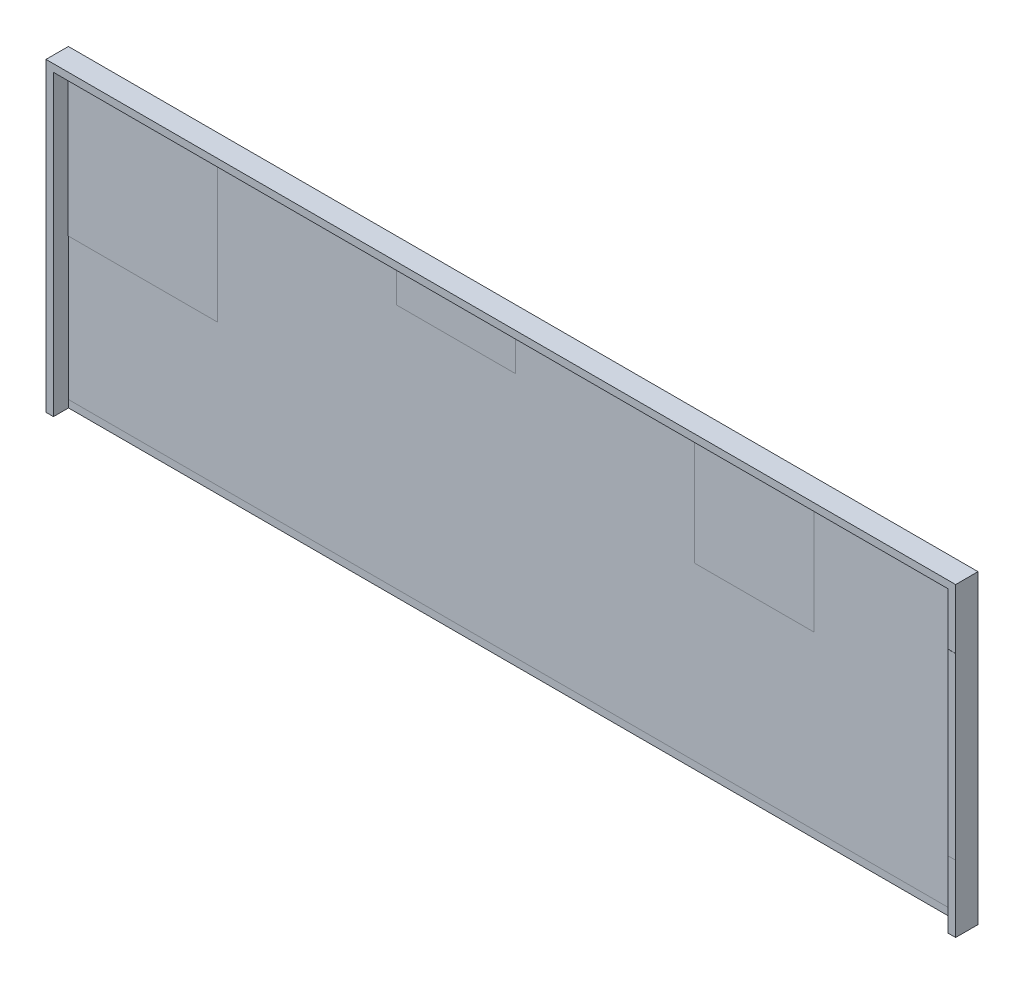
ISO-10303-21;
HEADER;
FILE_DESCRIPTION(('STEP AP214'),'2;1');
FILE_NAME('part.step','',(''),(''),'','','');
FILE_SCHEMA(('AUTOMOTIVE_DESIGN { 1 0 10303 214 1 1 1 1 }'));
ENDSEC;
DATA;
#1=APPLICATION_CONTEXT('core data for automotive mechanical design processes');
#2=APPLICATION_PROTOCOL_DEFINITION('international standard','automotive_design',2000,#1);
#3=PRODUCT_CONTEXT('',#1,'mechanical');
#4=PRODUCT('Part','Part','',(#3));
#5=PRODUCT_RELATED_PRODUCT_CATEGORY('part','',(#4));
#6=PRODUCT_DEFINITION_FORMATION('','',#4);
#7=PRODUCT_DEFINITION_CONTEXT('part definition',#1,'design');
#8=PRODUCT_DEFINITION('design','',#6,#7);
#9=PRODUCT_DEFINITION_SHAPE('','',#8);
#10=(LENGTH_UNIT() NAMED_UNIT(*) SI_UNIT(.MILLI.,.METRE.));
#11=(NAMED_UNIT(*) PLANE_ANGLE_UNIT() SI_UNIT($,.RADIAN.));
#12=(NAMED_UNIT(*) SI_UNIT($,.STERADIAN.) SOLID_ANGLE_UNIT());
#13=UNCERTAINTY_MEASURE_WITH_UNIT(LENGTH_MEASURE(1.E-05),#10,'distance_accuracy_value','');
#14=(GEOMETRIC_REPRESENTATION_CONTEXT(3) GLOBAL_UNCERTAINTY_ASSIGNED_CONTEXT((#13)) GLOBAL_UNIT_ASSIGNED_CONTEXT((#10,
#11,#12)) REPRESENTATION_CONTEXT('',''));
#15=CARTESIAN_POINT('',(0.,0.,0.));
#16=DIRECTION('',(0.,0.,1.));
#17=DIRECTION('',(1.,0.,0.));
#18=AXIS2_PLACEMENT_3D('',#15,#16,#17);
#19=CARTESIAN_POINT('',(0.,0.,150.));
#20=DIRECTION('',(0.,0.,1.));
#21=DIRECTION('',(1.,0.,0.));
#22=AXIS2_PLACEMENT_3D('',#19,#20,#21);
#23=PLANE('',#22);
#24=DIRECTION('',(1.,0.,0.));
#25=VECTOR('',#24,1.);
#26=CARTESIAN_POINT('',(-2432.43243243243,-921.62162162162,150.));
#27=LINE('',#26,#25);
#28=CARTESIAN_POINT('',(-2432.43243243243,-921.62162162162,150.));
#29=VERTEX_POINT('',#28);
#30=CARTESIAN_POINT('',(-2382.43243243243,-921.62162162162,150.));
#31=VERTEX_POINT('',#30);
#32=EDGE_CURVE('E445',#29,#31,#27,.T.);
#33=ORIENTED_EDGE('',*,*,#32,.T.);
#34=DIRECTION('',(0.,-1.,0.));
#35=VECTOR('',#34,1.);
#36=CARTESIAN_POINT('',(-2382.43243243243,1128.37837837838,150.));
#37=LINE('',#36,#35);
#38=CARTESIAN_POINT('',(-2382.43243243243,1078.37837837838,150.));
#39=VERTEX_POINT('',#38);
#40=EDGE_CURVE('E224',#39,#31,#37,.T.);
#41=ORIENTED_EDGE('',*,*,#40,.F.);
#42=DIRECTION('',(-1.,0.,0.));
#43=VECTOR('',#42,1.);
#44=CARTESIAN_POINT('',(-2432.43243243243,1078.37837837838,150.));
#45=LINE('',#44,#43);
#46=CARTESIAN_POINT('',(3617.56756756757,1078.37837837838,150.));
#47=VERTEX_POINT('',#46);
#48=EDGE_CURVE('E414',#47,#39,#45,.T.);
#49=ORIENTED_EDGE('',*,*,#48,.F.);
#50=DIRECTION('',(0.,1.,0.));
#51=VECTOR('',#50,1.);
#52=CARTESIAN_POINT('',(3617.56756756757,1128.37837837838,150.));
#53=LINE('',#52,#51);
#54=CARTESIAN_POINT('',(3617.56756756757,728.378378378379,150.));
#55=VERTEX_POINT('',#54);
#56=EDGE_CURVE('E70',#55,#47,#53,.T.);
#57=ORIENTED_EDGE('',*,*,#56,.F.);
#58=DIRECTION('',(-1.,0.,0.));
#59=VECTOR('',#58,1.);
#60=CARTESIAN_POINT('',(3617.56756756757,728.378378378379,150.));
#61=LINE('',#60,#59);
#62=CARTESIAN_POINT('',(3667.56756756757,728.378378378379,150.));
#63=VERTEX_POINT('',#62);
#64=EDGE_CURVE('E65',#63,#55,#61,.T.);
#65=ORIENTED_EDGE('',*,*,#64,.F.);
#66=DIRECTION('',(0.,1.,0.));
#67=VECTOR('',#66,1.);
#68=CARTESIAN_POINT('',(3667.56756756757,1128.37837837838,150.));
#69=LINE('',#68,#67);
#70=CARTESIAN_POINT('',(3667.56756756757,1128.37837837838,150.));
#71=VERTEX_POINT('',#70);
#72=EDGE_CURVE('E448',#63,#71,#69,.T.);
#73=ORIENTED_EDGE('',*,*,#72,.T.);
#74=DIRECTION('',(-1.,0.,0.));
#75=VECTOR('',#74,1.);
#76=CARTESIAN_POINT('',(-2432.43243243243,1128.37837837838,150.));
#77=LINE('',#76,#75);
#78=CARTESIAN_POINT('',(-2432.43243243243,1128.37837837838,150.));
#79=VERTEX_POINT('',#78);
#80=EDGE_CURVE('E452',#71,#79,#77,.T.);
#81=ORIENTED_EDGE('',*,*,#80,.T.);
#82=DIRECTION('',(0.,-1.,0.));
#83=VECTOR('',#82,1.);
#84=CARTESIAN_POINT('',(-2432.43243243243,1128.37837837838,150.));
#85=LINE('',#84,#83);
#86=EDGE_CURVE('E439',#79,#29,#85,.T.);
#87=ORIENTED_EDGE('',*,*,#86,.T.);
#88=EDGE_LOOP('',(#33,#41,#49,#57,#65,#73,#81,#87));
#89=FACE_BOUND('',#88,.T.);
#90=ADVANCED_FACE('F49',(#89),#23,.T.);
#91=CARTESIAN_POINT('',(0.,0.,50.));
#92=DIRECTION('',(0.,0.,1.));
#93=DIRECTION('',(1.,0.,0.));
#94=AXIS2_PLACEMENT_3D('',#91,#92,#93);
#95=PLANE('',#94);
#96=DIRECTION('',(1.,0.,0.));
#97=VECTOR('',#96,1.);
#98=CARTESIAN_POINT('',(-182.432432432432,778.37837837838,50.));
#99=LINE('',#98,#97);
#100=CARTESIAN_POINT('',(-182.432432432432,778.37837837838,50.));
#101=VERTEX_POINT('',#100);
#102=CARTESIAN_POINT('',(617.567567567568,778.37837837838,50.));
#103=VERTEX_POINT('',#102);
#104=EDGE_CURVE('E308',#101,#103,#99,.T.);
#105=ORIENTED_EDGE('',*,*,#104,.F.);
#106=DIRECTION('',(0.,-1.,0.));
#107=VECTOR('',#106,1.);
#108=CARTESIAN_POINT('',(-182.432432432432,1078.37837837838,50.));
#109=LINE('',#108,#107);
#110=CARTESIAN_POINT('',(-182.432432432432,1078.37837837838,50.));
#111=VERTEX_POINT('',#110);
#112=EDGE_CURVE('E287',#111,#101,#109,.T.);
#113=ORIENTED_EDGE('',*,*,#112,.F.);
#114=DIRECTION('',(-1.,0.,0.));
#115=VECTOR('',#114,1.);
#116=CARTESIAN_POINT('',(-2432.43243243243,1078.37837837838,50.));
#117=LINE('',#116,#115);
#118=CARTESIAN_POINT('',(-1382.43243243243,1078.37837837838,50.));
#119=VERTEX_POINT('',#118);
#120=EDGE_CURVE('E421',#111,#119,#117,.T.);
#121=ORIENTED_EDGE('',*,*,#120,.T.);
#122=DIRECTION('',(0.,-1.,0.));
#123=VECTOR('',#122,1.);
#124=CARTESIAN_POINT('',(-1382.43243243243,1078.37837837838,50.));
#125=LINE('',#124,#123);
#126=CARTESIAN_POINT('',(-1382.43243243243,78.3783783783796,50.));
#127=VERTEX_POINT('',#126);
#128=EDGE_CURVE('E377',#119,#127,#125,.T.);
#129=ORIENTED_EDGE('',*,*,#128,.T.);
#130=DIRECTION('',(1.,0.,0.));
#131=VECTOR('',#130,1.);
#132=CARTESIAN_POINT('',(-2382.43243243243,78.3783783783796,50.));
#133=LINE('',#132,#131);
#134=CARTESIAN_POINT('',(-2382.43243243243,78.3783783783796,50.));
#135=VERTEX_POINT('',#134);
#136=EDGE_CURVE('E371',#135,#127,#133,.T.);
#137=ORIENTED_EDGE('',*,*,#136,.F.);
#138=DIRECTION('',(0.,-1.,0.));
#139=VECTOR('',#138,1.);
#140=CARTESIAN_POINT('',(-2382.43243243243,1128.37837837838,50.));
#141=LINE('',#140,#139);
#142=CARTESIAN_POINT('',(-2382.43243243243,-871.62162162162,50.));
#143=VERTEX_POINT('',#142);
#144=EDGE_CURVE('E404',#135,#143,#141,.T.);
#145=ORIENTED_EDGE('',*,*,#144,.T.);
#146=DIRECTION('',(1.,0.,0.));
#147=VECTOR('',#146,1.);
#148=CARTESIAN_POINT('',(-2432.43243243243,-871.62162162162,50.));
#149=LINE('',#148,#147);
#150=CARTESIAN_POINT('',(3617.56756756757,-871.62162162162,50.));
#151=VERTEX_POINT('',#150);
#152=EDGE_CURVE('E408',#143,#151,#149,.T.);
#153=ORIENTED_EDGE('',*,*,#152,.T.);
#154=DIRECTION('',(0.,1.,0.));
#155=VECTOR('',#154,1.);
#156=CARTESIAN_POINT('',(3617.56756756757,1128.37837837838,50.));
#157=LINE('',#156,#155);
#158=CARTESIAN_POINT('',(3617.56756756757,1078.37837837838,50.));
#159=VERTEX_POINT('',#158);
#160=EDGE_CURVE('E418',#151,#159,#157,.T.);
#161=ORIENTED_EDGE('',*,*,#160,.T.);
#162=CARTESIAN_POINT('',(2617.56756756757,1078.37837837838,50.));
#163=VERTEX_POINT('',#162);
#164=EDGE_CURVE('E426',#159,#163,#117,.T.);
#165=ORIENTED_EDGE('',*,*,#164,.T.);
#166=DIRECTION('',(0.,1.,0.));
#167=VECTOR('',#166,1.);
#168=CARTESIAN_POINT('',(2617.56756756757,1078.37837837838,50.));
#169=LINE('',#168,#167);
#170=CARTESIAN_POINT('',(2617.56756756757,278.37837837838,50.));
#171=VERTEX_POINT('',#170);
#172=EDGE_CURVE('E335',#171,#163,#169,.T.);
#173=ORIENTED_EDGE('',*,*,#172,.F.);
#174=DIRECTION('',(1.,0.,0.));
#175=VECTOR('',#174,1.);
#176=CARTESIAN_POINT('',(1817.56756756757,278.37837837838,50.));
#177=LINE('',#176,#175);
#178=CARTESIAN_POINT('',(1817.56756756757,278.37837837838,50.));
#179=VERTEX_POINT('',#178);
#180=EDGE_CURVE('E350',#179,#171,#177,.T.);
#181=ORIENTED_EDGE('',*,*,#180,.F.);
#182=DIRECTION('',(0.,-1.,0.));
#183=VECTOR('',#182,1.);
#184=CARTESIAN_POINT('',(1817.56756756757,1078.37837837838,50.));
#185=LINE('',#184,#183);
#186=CARTESIAN_POINT('',(1817.56756756756,1078.37837837838,50.));
#187=VERTEX_POINT('',#186);
#188=EDGE_CURVE('E329',#187,#179,#185,.T.);
#189=ORIENTED_EDGE('',*,*,#188,.F.);
#190=CARTESIAN_POINT('',(617.567567567567,1078.37837837838,50.));
#191=VERTEX_POINT('',#190);
#192=EDGE_CURVE('E430',#187,#191,#117,.T.);
#193=ORIENTED_EDGE('',*,*,#192,.T.);
#194=DIRECTION('',(0.,1.,0.));
#195=VECTOR('',#194,1.);
#196=CARTESIAN_POINT('',(617.567567567568,1078.37837837838,50.));
#197=LINE('',#196,#195);
#198=EDGE_CURVE('E293',#103,#191,#197,.T.);
#199=ORIENTED_EDGE('',*,*,#198,.F.);
#200=EDGE_LOOP('',(#105,#113,#121,#129,#137,#145,#153,#161,#165,#173,#181,#189,#193,#199));
#201=FACE_BOUND('',#200,.T.);
#202=ADVANCED_FACE('F506',(#201),#95,.T.);
#203=CARTESIAN_POINT('',(-2432.43243243243,1078.37837837838,150.));
#204=DIRECTION('',(0.,-1.,0.));
#205=DIRECTION('',(0.,0.,-1.));
#206=AXIS2_PLACEMENT_3D('',#203,#204,#205);
#207=PLANE('',#206);
#208=ORIENTED_EDGE('',*,*,#120,.F.);
#209=DIRECTION('',(0.,0.,-1.));
#210=VECTOR('',#209,1.);
#211=CARTESIAN_POINT('',(-182.432432432432,1078.37837837838,51.));
#212=LINE('',#211,#210);
#213=CARTESIAN_POINT('',(-182.432432432432,1078.37837837838,51.));
#214=VERTEX_POINT('',#213);
#215=EDGE_CURVE('E304',#214,#111,#212,.T.);
#216=ORIENTED_EDGE('',*,*,#215,.F.);
#217=DIRECTION('',(-1.,0.,0.));
#218=VECTOR('',#217,1.);
#219=CARTESIAN_POINT('',(-182.432432432432,1078.37837837838,51.));
#220=LINE('',#219,#218);
#221=CARTESIAN_POINT('',(617.567567567567,1078.37837837838,51.));
#222=VERTEX_POINT('',#221);
#223=EDGE_CURVE('E300',#222,#214,#220,.T.);
#224=ORIENTED_EDGE('',*,*,#223,.F.);
#225=DIRECTION('',(0.,0.,-1.));
#226=VECTOR('',#225,1.);
#227=CARTESIAN_POINT('',(617.567567567568,1078.37837837838,51.));
#228=LINE('',#227,#226);
#229=EDGE_CURVE('E318',#222,#191,#228,.T.);
#230=ORIENTED_EDGE('',*,*,#229,.T.);
#231=ORIENTED_EDGE('',*,*,#192,.F.);
#232=DIRECTION('',(0.,0.,-1.));
#233=VECTOR('',#232,1.);
#234=CARTESIAN_POINT('',(1817.56756756757,1078.37837837838,51.));
#235=LINE('',#234,#233);
#236=CARTESIAN_POINT('',(1817.56756756757,1078.37837837838,51.));
#237=VERTEX_POINT('',#236);
#238=EDGE_CURVE('E346',#237,#187,#235,.T.);
#239=ORIENTED_EDGE('',*,*,#238,.F.);
#240=DIRECTION('',(-1.,0.,0.));
#241=VECTOR('',#240,1.);
#242=CARTESIAN_POINT('',(1817.56756756757,1078.37837837838,51.));
#243=LINE('',#242,#241);
#244=CARTESIAN_POINT('',(2617.56756756757,1078.37837837838,51.));
#245=VERTEX_POINT('',#244);
#246=EDGE_CURVE('E342',#245,#237,#243,.T.);
#247=ORIENTED_EDGE('',*,*,#246,.F.);
#248=DIRECTION('',(0.,0.,-1.));
#249=VECTOR('',#248,1.);
#250=CARTESIAN_POINT('',(2617.56756756757,1078.37837837838,51.));
#251=LINE('',#250,#249);
#252=EDGE_CURVE('E360',#245,#163,#251,.T.);
#253=ORIENTED_EDGE('',*,*,#252,.T.);
#254=ORIENTED_EDGE('',*,*,#164,.F.);
#255=DIRECTION('',(0.,0.,-1.));
#256=VECTOR('',#255,1.);
#257=CARTESIAN_POINT('',(3617.56756756757,1078.37837837838,150.));
#258=LINE('',#257,#256);
#259=EDGE_CURVE('E413',#47,#159,#258,.T.);
#260=ORIENTED_EDGE('',*,*,#259,.F.);
#261=ORIENTED_EDGE('',*,*,#48,.T.);
#262=DIRECTION('',(0.,0.,-1.));
#263=VECTOR('',#262,1.);
#264=CARTESIAN_POINT('',(-2382.43243243243,1078.37837837838,150.));
#265=LINE('',#264,#263);
#266=CARTESIAN_POINT('',(-2382.43243243243,1078.37837837838,51.));
#267=VERTEX_POINT('',#266);
#268=EDGE_CURVE('E409',#39,#267,#265,.T.);
#269=ORIENTED_EDGE('',*,*,#268,.T.);
#270=DIRECTION('',(1.,0.,0.));
#271=VECTOR('',#270,1.);
#272=CARTESIAN_POINT('',(-2382.43243243243,1078.37837837838,51.));
#273=LINE('',#272,#271);
#274=CARTESIAN_POINT('',(-1382.43243243243,1078.37837837838,51.));
#275=VERTEX_POINT('',#274);
#276=EDGE_CURVE('E384',#267,#275,#273,.T.);
#277=ORIENTED_EDGE('',*,*,#276,.T.);
#278=DIRECTION('',(0.,0.,-1.));
#279=VECTOR('',#278,1.);
#280=CARTESIAN_POINT('',(-1382.43243243243,1078.37837837838,51.));
#281=LINE('',#280,#279);
#282=EDGE_CURVE('E387',#275,#119,#281,.T.);
#283=ORIENTED_EDGE('',*,*,#282,.T.);
#284=EDGE_LOOP('',(#208,#216,#224,#230,#231,#239,#247,#253,#254,#260,#261,#269,#277,#283));
#285=FACE_BOUND('',#284,.T.);
#286=ADVANCED_FACE('F516',(#285),#207,.T.);
#287=CARTESIAN_POINT('',(-2382.43243243243,1128.37837837838,150.));
#288=DIRECTION('',(1.,0.,0.));
#289=DIRECTION('',(0.,1.,0.));
#290=AXIS2_PLACEMENT_3D('',#287,#288,#289);
#291=PLANE('',#290);
#292=ORIENTED_EDGE('',*,*,#144,.F.);
#293=DIRECTION('',(0.,0.,-1.));
#294=VECTOR('',#293,1.);
#295=CARTESIAN_POINT('',(-2382.43243243243,78.3783783783796,51.));
#296=LINE('',#295,#294);
#297=CARTESIAN_POINT('',(-2382.43243243243,78.3783783783796,51.));
#298=VERTEX_POINT('',#297);
#299=EDGE_CURVE('E400',#298,#135,#296,.T.);
#300=ORIENTED_EDGE('',*,*,#299,.F.);
#301=DIRECTION('',(0.,-1.,0.));
#302=VECTOR('',#301,1.);
#303=CARTESIAN_POINT('',(-2382.43243243243,1078.37837837838,51.));
#304=LINE('',#303,#302);
#305=EDGE_CURVE('E372',#267,#298,#304,.T.);
#306=ORIENTED_EDGE('',*,*,#305,.F.);
#307=ORIENTED_EDGE('',*,*,#268,.F.);
#308=ORIENTED_EDGE('',*,*,#40,.T.);
#309=DIRECTION('',(0.,0.,1.));
#310=VECTOR('',#309,1.);
#311=CARTESIAN_POINT('',(-2382.43243243243,-921.62162162162,49.));
#312=LINE('',#311,#310);
#313=CARTESIAN_POINT('',(-2382.43243243243,-921.62162162162,49.));
#314=VERTEX_POINT('',#313);
#315=EDGE_CURVE('E215',#314,#31,#312,.T.);
#316=ORIENTED_EDGE('',*,*,#315,.F.);
#317=DIRECTION('',(0.,-1.,0.));
#318=VECTOR('',#317,1.);
#319=CARTESIAN_POINT('',(-2382.43243243243,-871.62162162162,49.));
#320=LINE('',#319,#318);
#321=CARTESIAN_POINT('',(-2382.43243243243,-871.62162162162,49.));
#322=VERTEX_POINT('',#321);
#323=EDGE_CURVE('E220',#322,#314,#320,.T.);
#324=ORIENTED_EDGE('',*,*,#323,.F.);
#325=DIRECTION('',(0.,0.,1.));
#326=VECTOR('',#325,1.);
#327=CARTESIAN_POINT('',(-2382.43243243243,-871.62162162162,49.));
#328=LINE('',#327,#326);
#329=EDGE_CURVE('E247',#322,#143,#328,.T.);
#330=ORIENTED_EDGE('',*,*,#329,.T.);
#331=EDGE_LOOP('',(#292,#300,#306,#307,#308,#316,#324,#330));
#332=FACE_BOUND('',#331,.T.);
#333=ADVANCED_FACE('F218',(#332),#291,.T.);
#334=CARTESIAN_POINT('',(-2432.43243243243,1128.37837837838,150.));
#335=DIRECTION('',(1.,0.,0.));
#336=DIRECTION('',(0.,1.,0.));
#337=AXIS2_PLACEMENT_3D('',#334,#335,#336);
#338=PLANE('',#337);
#339=DIRECTION('',(0.,-1.,0.));
#340=VECTOR('',#339,1.);
#341=CARTESIAN_POINT('',(-2432.43243243243,1128.37837837838,0.));
#342=LINE('',#341,#340);
#343=CARTESIAN_POINT('',(-2432.43243243243,1128.37837837838,0.));
#344=VERTEX_POINT('',#343);
#345=CARTESIAN_POINT('',(-2432.43243243243,-921.62162162162,0.));
#346=VERTEX_POINT('',#345);
#347=EDGE_CURVE('E425',#344,#346,#342,.T.);
#348=ORIENTED_EDGE('',*,*,#347,.T.);
#349=DIRECTION('',(0.,0.,-1.));
#350=VECTOR('',#349,1.);
#351=CARTESIAN_POINT('',(-2432.43243243243,-921.62162162162,150.));
#352=LINE('',#351,#350);
#353=EDGE_CURVE('E11',#29,#346,#352,.T.);
#354=ORIENTED_EDGE('',*,*,#353,.F.);
#355=ORIENTED_EDGE('',*,*,#86,.F.);
#356=DIRECTION('',(0.,0.,-1.));
#357=VECTOR('',#356,1.);
#358=CARTESIAN_POINT('',(-2432.43243243243,1128.37837837838,150.));
#359=LINE('',#358,#357);
#360=EDGE_CURVE('E455',#79,#344,#359,.T.);
#361=ORIENTED_EDGE('',*,*,#360,.T.);
#362=EDGE_LOOP('',(#348,#354,#355,#361));
#363=FACE_BOUND('',#362,.T.);
#364=ADVANCED_FACE('F51',(#363),#338,.F.);
#365=CARTESIAN_POINT('',(-2432.43243243243,-921.62162162162,150.));
#366=DIRECTION('',(0.,1.,0.));
#367=DIRECTION('',(0.,0.,1.));
#368=AXIS2_PLACEMENT_3D('',#365,#366,#367);
#369=PLANE('',#368);
#370=DIRECTION('',(1.,0.,0.));
#371=VECTOR('',#370,1.);
#372=CARTESIAN_POINT('',(-2382.43243243243,-921.62162162162,49.));
#373=LINE('',#372,#371);
#374=CARTESIAN_POINT('',(3617.56756756757,-921.62162162162,49.));
#375=VERTEX_POINT('',#374);
#376=EDGE_CURVE('E235',#314,#375,#373,.T.);
#377=ORIENTED_EDGE('',*,*,#376,.F.);
#378=ORIENTED_EDGE('',*,*,#315,.T.);
#379=ORIENTED_EDGE('',*,*,#32,.F.);
#380=ORIENTED_EDGE('',*,*,#353,.T.);
#381=DIRECTION('',(1.,0.,0.));
#382=VECTOR('',#381,1.);
#383=CARTESIAN_POINT('',(-2432.43243243243,-921.62162162162,0.));
#384=LINE('',#383,#382);
#385=CARTESIAN_POINT('',(3667.56756756757,-921.62162162162,0.));
#386=VERTEX_POINT('',#385);
#387=EDGE_CURVE('E459',#346,#386,#384,.T.);
#388=ORIENTED_EDGE('',*,*,#387,.T.);
#389=DIRECTION('',(0.,0.,-1.));
#390=VECTOR('',#389,1.);
#391=CARTESIAN_POINT('',(3667.56756756757,-921.62162162162,150.));
#392=LINE('',#391,#390);
#393=CARTESIAN_POINT('',(3667.56756756757,-921.62162162162,150.));
#394=VERTEX_POINT('',#393);
#395=EDGE_CURVE('E58',#394,#386,#392,.T.);
#396=ORIENTED_EDGE('',*,*,#395,.F.);
#397=CARTESIAN_POINT('',(3617.56756756757,-921.62162162162,150.));
#398=VERTEX_POINT('',#397);
#399=EDGE_CURVE('E443',#398,#394,#27,.T.);
#400=ORIENTED_EDGE('',*,*,#399,.F.);
#401=DIRECTION('',(0.,0.,1.));
#402=VECTOR('',#401,1.);
#403=CARTESIAN_POINT('',(3617.56756756757,-921.62162162162,49.));
#404=LINE('',#403,#402);
#405=EDGE_CURVE('E228',#375,#398,#404,.T.);
#406=ORIENTED_EDGE('',*,*,#405,.F.);
#407=EDGE_LOOP('',(#377,#378,#379,#380,#388,#396,#400,#406));
#408=FACE_BOUND('',#407,.T.);
#409=ADVANCED_FACE('F239',(#408),#369,.F.);
#410=CARTESIAN_POINT('',(3667.56756756757,1128.37837837838,150.));
#411=DIRECTION('',(-1.,0.,0.));
#412=DIRECTION('',(0.,-1.,0.));
#413=AXIS2_PLACEMENT_3D('',#410,#411,#412);
#414=PLANE('',#413);
#415=DIRECTION('',(0.,1.,0.));
#416=VECTOR('',#415,1.);
#417=CARTESIAN_POINT('',(3667.56756756757,1128.37837837838,0.));
#418=LINE('',#417,#416);
#419=CARTESIAN_POINT('',(3667.56756756757,1128.37837837838,0.));
#420=VERTEX_POINT('',#419);
#421=EDGE_CURVE('E462',#386,#420,#418,.T.);
#422=ORIENTED_EDGE('',*,*,#421,.T.);
#423=DIRECTION('',(0.,0.,-1.));
#424=VECTOR('',#423,1.);
#425=CARTESIAN_POINT('',(3667.56756756757,1128.37837837838,150.));
#426=LINE('',#425,#424);
#427=EDGE_CURVE('E470',#71,#420,#426,.T.);
#428=ORIENTED_EDGE('',*,*,#427,.F.);
#429=ORIENTED_EDGE('',*,*,#72,.F.);
#430=DIRECTION('',(0.,0.,-1.));
#431=VECTOR('',#430,1.);
#432=CARTESIAN_POINT('',(3667.56756756757,728.37837837838,151.));
#433=LINE('',#432,#431);
#434=CARTESIAN_POINT('',(3667.56756756757,728.37837837838,151.));
#435=VERTEX_POINT('',#434);
#436=EDGE_CURVE('E275',#435,#63,#433,.T.);
#437=ORIENTED_EDGE('',*,*,#436,.F.);
#438=DIRECTION('',(0.,1.,0.));
#439=VECTOR('',#438,1.);
#440=CARTESIAN_POINT('',(3667.56756756757,728.37837837838,151.));
#441=LINE('',#440,#439);
#442=CARTESIAN_POINT('',(3667.56756756757,-471.62162162162,151.));
#443=VERTEX_POINT('',#442);
#444=EDGE_CURVE('E260',#443,#435,#441,.T.);
#445=ORIENTED_EDGE('',*,*,#444,.F.);
#446=DIRECTION('',(0.,0.,-1.));
#447=VECTOR('',#446,1.);
#448=CARTESIAN_POINT('',(3667.56756756757,-471.62162162162,151.));
#449=LINE('',#448,#447);
#450=CARTESIAN_POINT('',(3667.56756756757,-471.62162162162,150.));
#451=VERTEX_POINT('',#450);
#452=EDGE_CURVE('E279',#443,#451,#449,.T.);
#453=ORIENTED_EDGE('',*,*,#452,.T.);
#454=EDGE_CURVE('E449',#394,#451,#69,.T.);
#455=ORIENTED_EDGE('',*,*,#454,.F.);
#456=ORIENTED_EDGE('',*,*,#395,.T.);
#457=EDGE_LOOP('',(#422,#428,#429,#437,#445,#453,#455,#456));
#458=FACE_BOUND('',#457,.T.);
#459=ADVANCED_FACE('F479',(#458),#414,.F.);
#460=CARTESIAN_POINT('',(-2432.43243243243,1128.37837837838,150.));
#461=DIRECTION('',(0.,-1.,0.));
#462=DIRECTION('',(0.,0.,-1.));
#463=AXIS2_PLACEMENT_3D('',#460,#461,#462);
#464=PLANE('',#463);
#465=DIRECTION('',(-1.,0.,0.));
#466=VECTOR('',#465,1.);
#467=CARTESIAN_POINT('',(-2432.43243243243,1128.37837837838,0.));
#468=LINE('',#467,#466);
#469=EDGE_CURVE('E444',#420,#344,#468,.T.);
#470=ORIENTED_EDGE('',*,*,#469,.T.);
#471=ORIENTED_EDGE('',*,*,#360,.F.);
#472=ORIENTED_EDGE('',*,*,#80,.F.);
#473=ORIENTED_EDGE('',*,*,#427,.T.);
#474=EDGE_LOOP('',(#470,#471,#472,#473));
#475=FACE_BOUND('',#474,.T.);
#476=ADVANCED_FACE('F487',(#475),#464,.F.);
#477=CARTESIAN_POINT('',(3617.56756756757,-471.62162162162,150.));
#478=VERTEX_POINT('',#477);
#479=EDGE_CURVE('E433',#398,#478,#53,.T.);
#480=ORIENTED_EDGE('',*,*,#479,.F.);
#481=ORIENTED_EDGE('',*,*,#399,.T.);
#482=ORIENTED_EDGE('',*,*,#454,.T.);
#483=DIRECTION('',(1.,0.,0.));
#484=VECTOR('',#483,1.);
#485=CARTESIAN_POINT('',(3617.56756756757,-471.62162162162,150.));
#486=LINE('',#485,#484);
#487=EDGE_CURVE('E249',#478,#451,#486,.T.);
#488=ORIENTED_EDGE('',*,*,#487,.F.);
#489=EDGE_LOOP('',(#480,#481,#482,#488));
#490=FACE_BOUND('',#489,.T.);
#491=ADVANCED_FACE('F498',(#490),#23,.T.);
#492=CARTESIAN_POINT('',(0.,0.,0.));
#493=DIRECTION('',(0.,0.,1.));
#494=DIRECTION('',(1.,0.,0.));
#495=AXIS2_PLACEMENT_3D('',#492,#493,#494);
#496=PLANE('',#495);
#497=ORIENTED_EDGE('',*,*,#347,.F.);
#498=ORIENTED_EDGE('',*,*,#469,.F.);
#499=ORIENTED_EDGE('',*,*,#421,.F.);
#500=ORIENTED_EDGE('',*,*,#387,.F.);
#501=EDGE_LOOP('',(#497,#498,#499,#500));
#502=FACE_BOUND('',#501,.T.);
#503=ADVANCED_FACE('F484',(#502),#496,.F.);
#504=CARTESIAN_POINT('',(3617.56756756757,1128.37837837838,150.));
#505=DIRECTION('',(-1.,0.,0.));
#506=DIRECTION('',(0.,-1.,0.));
#507=AXIS2_PLACEMENT_3D('',#504,#505,#506);
#508=PLANE('',#507);
#509=ORIENTED_EDGE('',*,*,#160,.F.);
#510=DIRECTION('',(0.,0.,1.));
#511=VECTOR('',#510,1.);
#512=CARTESIAN_POINT('',(3617.56756756757,-871.62162162162,49.));
#513=LINE('',#512,#511);
#514=CARTESIAN_POINT('',(3617.56756756757,-871.62162162162,49.));
#515=VERTEX_POINT('',#514);
#516=EDGE_CURVE('E250',#515,#151,#513,.T.);
#517=ORIENTED_EDGE('',*,*,#516,.F.);
#518=DIRECTION('',(0.,1.,0.));
#519=VECTOR('',#518,1.);
#520=CARTESIAN_POINT('',(3617.56756756757,-871.62162162162,49.));
#521=LINE('',#520,#519);
#522=EDGE_CURVE('E242',#375,#515,#521,.T.);
#523=ORIENTED_EDGE('',*,*,#522,.F.);
#524=ORIENTED_EDGE('',*,*,#405,.T.);
#525=ORIENTED_EDGE('',*,*,#479,.T.);
#526=DIRECTION('',(0.,0.,-1.));
#527=VECTOR('',#526,1.);
#528=CARTESIAN_POINT('',(3617.56756756757,-471.62162162162,151.));
#529=LINE('',#528,#527);
#530=CARTESIAN_POINT('',(3617.56756756757,-471.62162162162,151.));
#531=VERTEX_POINT('',#530);
#532=EDGE_CURVE('E283',#531,#478,#529,.T.);
#533=ORIENTED_EDGE('',*,*,#532,.F.);
#534=DIRECTION('',(0.,-1.,0.));
#535=VECTOR('',#534,1.);
#536=CARTESIAN_POINT('',(3617.56756756757,728.378378378379,151.));
#537=LINE('',#536,#535);
#538=CARTESIAN_POINT('',(3617.56756756757,728.378378378379,151.));
#539=VERTEX_POINT('',#538);
#540=EDGE_CURVE('E253',#539,#531,#537,.T.);
#541=ORIENTED_EDGE('',*,*,#540,.F.);
#542=DIRECTION('',(0.,0.,-1.));
#543=VECTOR('',#542,1.);
#544=CARTESIAN_POINT('',(3617.56756756757,728.378378378379,151.));
#545=LINE('',#544,#543);
#546=EDGE_CURVE('E266',#539,#55,#545,.T.);
#547=ORIENTED_EDGE('',*,*,#546,.T.);
#548=ORIENTED_EDGE('',*,*,#56,.T.);
#549=ORIENTED_EDGE('',*,*,#259,.T.);
#550=EDGE_LOOP('',(#509,#517,#523,#524,#525,#533,#541,#547,#548,#549));
#551=FACE_BOUND('',#550,.T.);
#552=ADVANCED_FACE('F502',(#551),#508,.T.);
#553=CARTESIAN_POINT('',(-2382.43243243243,78.3783783783796,51.));
#554=DIRECTION('',(0.,1.,0.));
#555=DIRECTION('',(0.,0.,1.));
#556=AXIS2_PLACEMENT_3D('',#553,#554,#555);
#557=PLANE('',#556);
#558=ORIENTED_EDGE('',*,*,#136,.T.);
#559=DIRECTION('',(0.,0.,-1.));
#560=VECTOR('',#559,1.);
#561=CARTESIAN_POINT('',(-1382.43243243243,78.3783783783796,51.));
#562=LINE('',#561,#560);
#563=CARTESIAN_POINT('',(-1382.43243243243,78.3783783783796,51.));
#564=VERTEX_POINT('',#563);
#565=EDGE_CURVE('E396',#564,#127,#562,.T.);
#566=ORIENTED_EDGE('',*,*,#565,.F.);
#567=DIRECTION('',(1.,0.,0.));
#568=VECTOR('',#567,1.);
#569=CARTESIAN_POINT('',(-2382.43243243243,78.3783783783796,51.));
#570=LINE('',#569,#568);
#571=EDGE_CURVE('E376',#298,#564,#570,.T.);
#572=ORIENTED_EDGE('',*,*,#571,.F.);
#573=ORIENTED_EDGE('',*,*,#299,.T.);
#574=EDGE_LOOP('',(#558,#566,#572,#573));
#575=FACE_BOUND('',#574,.T.);
#576=ADVANCED_FACE('F510',(#575),#557,.F.);
#577=CARTESIAN_POINT('',(-1382.43243243243,1078.37837837838,51.));
#578=DIRECTION('',(1.,0.,0.));
#579=DIRECTION('',(0.,1.,0.));
#580=AXIS2_PLACEMENT_3D('',#577,#578,#579);
#581=PLANE('',#580);
#582=ORIENTED_EDGE('',*,*,#128,.F.);
#583=ORIENTED_EDGE('',*,*,#282,.F.);
#584=DIRECTION('',(0.,-1.,0.));
#585=VECTOR('',#584,1.);
#586=CARTESIAN_POINT('',(-1382.43243243243,1078.37837837838,51.));
#587=LINE('',#586,#585);
#588=EDGE_CURVE('E380',#275,#564,#587,.T.);
#589=ORIENTED_EDGE('',*,*,#588,.T.);
#590=ORIENTED_EDGE('',*,*,#565,.T.);
#591=EDGE_LOOP('',(#582,#583,#589,#590));
#592=FACE_BOUND('',#591,.T.);
#593=ADVANCED_FACE('F522',(#592),#581,.T.);
#594=CARTESIAN_POINT('',(0.,0.,51.));
#595=DIRECTION('',(0.,0.,1.));
#596=DIRECTION('',(1.,0.,0.));
#597=AXIS2_PLACEMENT_3D('',#594,#595,#596);
#598=PLANE('',#597);
#599=ORIENTED_EDGE('',*,*,#305,.T.);
#600=ORIENTED_EDGE('',*,*,#571,.T.);
#601=ORIENTED_EDGE('',*,*,#588,.F.);
#602=ORIENTED_EDGE('',*,*,#276,.F.);
#603=EDGE_LOOP('',(#599,#600,#601,#602));
#604=FACE_BOUND('',#603,.T.);
#605=ADVANCED_FACE('F520',(#604),#598,.T.);
#606=CARTESIAN_POINT('',(1817.56756756757,1078.37837837838,51.));
#607=DIRECTION('',(1.,0.,0.));
#608=DIRECTION('',(0.,0.,-1.));
#609=AXIS2_PLACEMENT_3D('',#606,#607,#608);
#610=PLANE('',#609);
#611=ORIENTED_EDGE('',*,*,#188,.T.);
#612=DIRECTION('',(0.,0.,-1.));
#613=VECTOR('',#612,1.);
#614=CARTESIAN_POINT('',(1817.56756756757,278.37837837838,51.));
#615=LINE('',#614,#613);
#616=CARTESIAN_POINT('',(1817.56756756757,278.37837837838,51.));
#617=VERTEX_POINT('',#616);
#618=EDGE_CURVE('E367',#617,#179,#615,.T.);
#619=ORIENTED_EDGE('',*,*,#618,.F.);
#620=DIRECTION('',(0.,-1.,0.));
#621=VECTOR('',#620,1.);
#622=CARTESIAN_POINT('',(1817.56756756757,1078.37837837838,51.));
#623=LINE('',#622,#621);
#624=EDGE_CURVE('E330',#237,#617,#623,.T.);
#625=ORIENTED_EDGE('',*,*,#624,.F.);
#626=ORIENTED_EDGE('',*,*,#238,.T.);
#627=EDGE_LOOP('',(#611,#619,#625,#626));
#628=FACE_BOUND('',#627,.T.);
#629=ADVANCED_FACE('F591',(#628),#610,.F.);
#630=CARTESIAN_POINT('',(1817.56756756757,278.37837837838,51.));
#631=DIRECTION('',(0.,1.,0.));
#632=DIRECTION('',(0.,0.,1.));
#633=AXIS2_PLACEMENT_3D('',#630,#631,#632);
#634=PLANE('',#633);
#635=ORIENTED_EDGE('',*,*,#180,.T.);
#636=DIRECTION('',(0.,0.,-1.));
#637=VECTOR('',#636,1.);
#638=CARTESIAN_POINT('',(2617.56756756757,278.37837837838,51.));
#639=LINE('',#638,#637);
#640=CARTESIAN_POINT('',(2617.56756756757,278.37837837838,51.));
#641=VERTEX_POINT('',#640);
#642=EDGE_CURVE('E363',#641,#171,#639,.T.);
#643=ORIENTED_EDGE('',*,*,#642,.F.);
#644=DIRECTION('',(1.,0.,0.));
#645=VECTOR('',#644,1.);
#646=CARTESIAN_POINT('',(1817.56756756757,278.37837837838,51.));
#647=LINE('',#646,#645);
#648=EDGE_CURVE('E334',#617,#641,#647,.T.);
#649=ORIENTED_EDGE('',*,*,#648,.F.);
#650=ORIENTED_EDGE('',*,*,#618,.T.);
#651=EDGE_LOOP('',(#635,#643,#649,#650));
#652=FACE_BOUND('',#651,.T.);
#653=ADVANCED_FACE('F596',(#652),#634,.F.);
#654=CARTESIAN_POINT('',(2617.56756756757,1078.37837837838,51.));
#655=DIRECTION('',(-1.,0.,0.));
#656=DIRECTION('',(0.,0.,1.));
#657=AXIS2_PLACEMENT_3D('',#654,#655,#656);
#658=PLANE('',#657);
#659=ORIENTED_EDGE('',*,*,#172,.T.);
#660=ORIENTED_EDGE('',*,*,#252,.F.);
#661=DIRECTION('',(0.,1.,0.));
#662=VECTOR('',#661,1.);
#663=CARTESIAN_POINT('',(2617.56756756757,1078.37837837838,51.));
#664=LINE('',#663,#662);
#665=EDGE_CURVE('E338',#641,#245,#664,.T.);
#666=ORIENTED_EDGE('',*,*,#665,.F.);
#667=ORIENTED_EDGE('',*,*,#642,.T.);
#668=EDGE_LOOP('',(#659,#660,#666,#667));
#669=FACE_BOUND('',#668,.T.);
#670=ADVANCED_FACE('F600',(#669),#658,.F.);
#671=CARTESIAN_POINT('',(0.,0.,51.));
#672=DIRECTION('',(0.,0.,1.));
#673=DIRECTION('',(1.,0.,0.));
#674=AXIS2_PLACEMENT_3D('',#671,#672,#673);
#675=PLANE('',#674);
#676=ORIENTED_EDGE('',*,*,#624,.T.);
#677=ORIENTED_EDGE('',*,*,#648,.T.);
#678=ORIENTED_EDGE('',*,*,#665,.T.);
#679=ORIENTED_EDGE('',*,*,#246,.T.);
#680=EDGE_LOOP('',(#676,#677,#678,#679));
#681=FACE_BOUND('',#680,.T.);
#682=ADVANCED_FACE('F546',(#681),#675,.T.);
#683=CARTESIAN_POINT('',(-182.432432432432,1078.37837837838,51.));
#684=DIRECTION('',(1.,0.,0.));
#685=DIRECTION('',(0.,1.,0.));
#686=AXIS2_PLACEMENT_3D('',#683,#684,#685);
#687=PLANE('',#686);
#688=ORIENTED_EDGE('',*,*,#112,.T.);
#689=DIRECTION('',(0.,0.,-1.));
#690=VECTOR('',#689,1.);
#691=CARTESIAN_POINT('',(-182.432432432432,778.37837837838,51.));
#692=LINE('',#691,#690);
#693=CARTESIAN_POINT('',(-182.432432432432,778.37837837838,51.));
#694=VERTEX_POINT('',#693);
#695=EDGE_CURVE('E325',#694,#101,#692,.T.);
#696=ORIENTED_EDGE('',*,*,#695,.F.);
#697=DIRECTION('',(0.,-1.,0.));
#698=VECTOR('',#697,1.);
#699=CARTESIAN_POINT('',(-182.432432432432,1078.37837837838,51.));
#700=LINE('',#699,#698);
#701=EDGE_CURVE('E288',#214,#694,#700,.T.);
#702=ORIENTED_EDGE('',*,*,#701,.F.);
#703=ORIENTED_EDGE('',*,*,#215,.T.);
#704=EDGE_LOOP('',(#688,#696,#702,#703));
#705=FACE_BOUND('',#704,.T.);
#706=ADVANCED_FACE('F525',(#705),#687,.F.);
#707=CARTESIAN_POINT('',(-182.432432432432,778.37837837838,51.));
#708=DIRECTION('',(0.,1.,0.));
#709=DIRECTION('',(0.,0.,1.));
#710=AXIS2_PLACEMENT_3D('',#707,#708,#709);
#711=PLANE('',#710);
#712=ORIENTED_EDGE('',*,*,#104,.T.);
#713=DIRECTION('',(0.,0.,-1.));
#714=VECTOR('',#713,1.);
#715=CARTESIAN_POINT('',(617.567567567568,778.37837837838,51.));
#716=LINE('',#715,#714);
#717=CARTESIAN_POINT('',(617.567567567568,778.37837837838,51.));
#718=VERTEX_POINT('',#717);
#719=EDGE_CURVE('E321',#718,#103,#716,.T.);
#720=ORIENTED_EDGE('',*,*,#719,.F.);
#721=DIRECTION('',(1.,0.,0.));
#722=VECTOR('',#721,1.);
#723=CARTESIAN_POINT('',(-182.432432432432,778.37837837838,51.));
#724=LINE('',#723,#722);
#725=EDGE_CURVE('E292',#694,#718,#724,.T.);
#726=ORIENTED_EDGE('',*,*,#725,.F.);
#727=ORIENTED_EDGE('',*,*,#695,.T.);
#728=EDGE_LOOP('',(#712,#720,#726,#727));
#729=FACE_BOUND('',#728,.T.);
#730=ADVANCED_FACE('F538',(#729),#711,.F.);
#731=CARTESIAN_POINT('',(617.567567567568,1078.37837837838,51.));
#732=DIRECTION('',(-1.,0.,0.));
#733=DIRECTION('',(0.,0.,1.));
#734=AXIS2_PLACEMENT_3D('',#731,#732,#733);
#735=PLANE('',#734);
#736=ORIENTED_EDGE('',*,*,#198,.T.);
#737=ORIENTED_EDGE('',*,*,#229,.F.);
#738=DIRECTION('',(0.,1.,0.));
#739=VECTOR('',#738,1.);
#740=CARTESIAN_POINT('',(617.567567567568,1078.37837837838,51.));
#741=LINE('',#740,#739);
#742=EDGE_CURVE('E296',#718,#222,#741,.T.);
#743=ORIENTED_EDGE('',*,*,#742,.F.);
#744=ORIENTED_EDGE('',*,*,#719,.T.);
#745=EDGE_LOOP('',(#736,#737,#743,#744));
#746=FACE_BOUND('',#745,.T.);
#747=ADVANCED_FACE('F536',(#746),#735,.F.);
#748=CARTESIAN_POINT('',(0.,0.,51.));
#749=DIRECTION('',(0.,0.,1.));
#750=DIRECTION('',(1.,0.,0.));
#751=AXIS2_PLACEMENT_3D('',#748,#749,#750);
#752=PLANE('',#751);
#753=ORIENTED_EDGE('',*,*,#701,.T.);
#754=ORIENTED_EDGE('',*,*,#725,.T.);
#755=ORIENTED_EDGE('',*,*,#742,.T.);
#756=ORIENTED_EDGE('',*,*,#223,.T.);
#757=EDGE_LOOP('',(#753,#754,#755,#756));
#758=FACE_BOUND('',#757,.T.);
#759=ADVANCED_FACE('F528',(#758),#752,.T.);
#760=CARTESIAN_POINT('',(3617.56756756757,-471.62162162162,151.));
#761=DIRECTION('',(0.,1.,0.));
#762=DIRECTION('',(-1.,0.,0.));
#763=AXIS2_PLACEMENT_3D('',#760,#761,#762);
#764=PLANE('',#763);
#765=ORIENTED_EDGE('',*,*,#487,.T.);
#766=ORIENTED_EDGE('',*,*,#452,.F.);
#767=DIRECTION('',(1.,0.,0.));
#768=VECTOR('',#767,1.);
#769=CARTESIAN_POINT('',(3617.56756756757,-471.62162162162,151.));
#770=LINE('',#769,#768);
#771=EDGE_CURVE('E257',#531,#443,#770,.T.);
#772=ORIENTED_EDGE('',*,*,#771,.F.);
#773=ORIENTED_EDGE('',*,*,#532,.T.);
#774=EDGE_LOOP('',(#765,#766,#772,#773));
#775=FACE_BOUND('',#774,.T.);
#776=ADVANCED_FACE('F625',(#775),#764,.F.);
#777=CARTESIAN_POINT('',(3617.56756756757,728.378378378379,151.));
#778=DIRECTION('',(0.,-1.,0.));
#779=DIRECTION('',(1.,0.,0.));
#780=AXIS2_PLACEMENT_3D('',#777,#778,#779);
#781=PLANE('',#780);
#782=ORIENTED_EDGE('',*,*,#64,.T.);
#783=ORIENTED_EDGE('',*,*,#546,.F.);
#784=DIRECTION('',(-1.,0.,0.));
#785=VECTOR('',#784,1.);
#786=CARTESIAN_POINT('',(3617.56756756757,728.378378378379,151.));
#787=LINE('',#786,#785);
#788=EDGE_CURVE('E263',#435,#539,#787,.T.);
#789=ORIENTED_EDGE('',*,*,#788,.F.);
#790=ORIENTED_EDGE('',*,*,#436,.T.);
#791=EDGE_LOOP('',(#782,#783,#789,#790));
#792=FACE_BOUND('',#791,.T.);
#793=ADVANCED_FACE('F619',(#792),#781,.F.);
#794=CARTESIAN_POINT('',(0.,0.,151.));
#795=DIRECTION('',(0.,0.,1.));
#796=DIRECTION('',(1.,0.,0.));
#797=AXIS2_PLACEMENT_3D('',#794,#795,#796);
#798=PLANE('',#797);
#799=ORIENTED_EDGE('',*,*,#540,.T.);
#800=ORIENTED_EDGE('',*,*,#771,.T.);
#801=ORIENTED_EDGE('',*,*,#444,.T.);
#802=ORIENTED_EDGE('',*,*,#788,.T.);
#803=EDGE_LOOP('',(#799,#800,#801,#802));
#804=FACE_BOUND('',#803,.T.);
#805=ADVANCED_FACE('F623',(#804),#798,.T.);
#806=CARTESIAN_POINT('',(-2382.43243243243,-871.62162162162,49.));
#807=DIRECTION('',(0.,1.,0.));
#808=DIRECTION('',(0.,0.,1.));
#809=AXIS2_PLACEMENT_3D('',#806,#807,#808);
#810=PLANE('',#809);
#811=ORIENTED_EDGE('',*,*,#152,.F.);
#812=ORIENTED_EDGE('',*,*,#329,.F.);
#813=DIRECTION('',(-1.,0.,0.));
#814=VECTOR('',#813,1.);
#815=CARTESIAN_POINT('',(-2382.43243243243,-871.62162162162,49.));
#816=LINE('',#815,#814);
#817=EDGE_CURVE('E229',#515,#322,#816,.T.);
#818=ORIENTED_EDGE('',*,*,#817,.F.);
#819=ORIENTED_EDGE('',*,*,#516,.T.);
#820=EDGE_LOOP('',(#811,#812,#818,#819));
#821=FACE_BOUND('',#820,.T.);
#822=ADVANCED_FACE('F504',(#821),#810,.F.);
#823=CARTESIAN_POINT('',(0.,0.,49.));
#824=DIRECTION('',(0.,0.,1.));
#825=DIRECTION('',(1.,0.,0.));
#826=AXIS2_PLACEMENT_3D('',#823,#824,#825);
#827=PLANE('',#826);
#828=ORIENTED_EDGE('',*,*,#323,.T.);
#829=ORIENTED_EDGE('',*,*,#376,.T.);
#830=ORIENTED_EDGE('',*,*,#522,.T.);
#831=ORIENTED_EDGE('',*,*,#817,.T.);
#832=EDGE_LOOP('',(#828,#829,#830,#831));
#833=FACE_BOUND('',#832,.T.);
#834=ADVANCED_FACE('F233',(#833),#827,.T.);
#835=CLOSED_SHELL('',(#90,#202,#286,#333,#364,#409,#459,#476,#491,#503,#552,#576,#593,#605,#629,
#653,#670,#682,#706,#730,#747,#759,#776,#793,#805,#822,#834));
#836=MANIFOLD_SOLID_BREP('B2',#835);
#837=ADVANCED_BREP_SHAPE_REPRESENTATION('',(#18,#836),#14);
#838=SHAPE_DEFINITION_REPRESENTATION(#9,#837);
ENDSEC;
END-ISO-10303-21;
